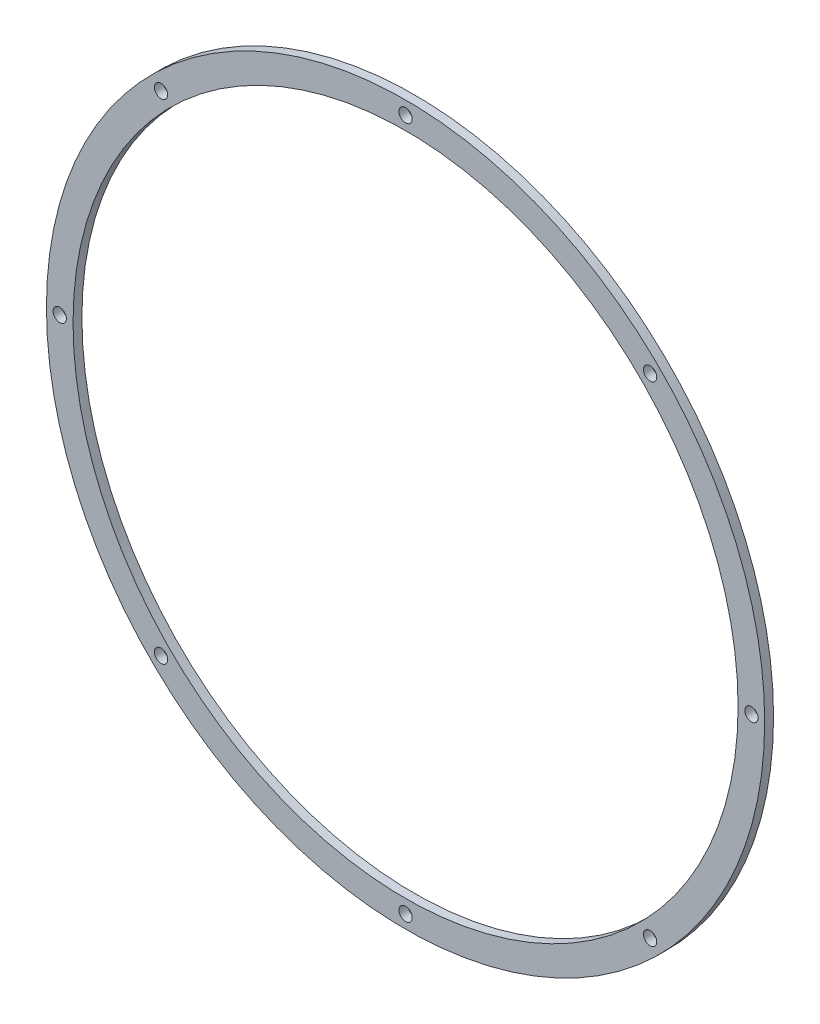
ISO-10303-21;
HEADER;
FILE_DESCRIPTION(('STEP AP214'),'2;1');
FILE_NAME('part.step','',(''),(''),'','','');
FILE_SCHEMA(('AUTOMOTIVE_DESIGN { 1 0 10303 214 1 1 1 1 }'));
ENDSEC;
DATA;
#1=APPLICATION_CONTEXT('core data for automotive mechanical design processes');
#2=APPLICATION_PROTOCOL_DEFINITION('international standard','automotive_design',2000,#1);
#3=PRODUCT_CONTEXT('',#1,'mechanical');
#4=PRODUCT('Part','Part','',(#3));
#5=PRODUCT_RELATED_PRODUCT_CATEGORY('part','',(#4));
#6=PRODUCT_DEFINITION_FORMATION('','',#4);
#7=PRODUCT_DEFINITION_CONTEXT('part definition',#1,'design');
#8=PRODUCT_DEFINITION('design','',#6,#7);
#9=PRODUCT_DEFINITION_SHAPE('','',#8);
#10=(LENGTH_UNIT() NAMED_UNIT(*) SI_UNIT(.MILLI.,.METRE.));
#11=(NAMED_UNIT(*) PLANE_ANGLE_UNIT() SI_UNIT($,.RADIAN.));
#12=(NAMED_UNIT(*) SI_UNIT($,.STERADIAN.) SOLID_ANGLE_UNIT());
#13=UNCERTAINTY_MEASURE_WITH_UNIT(LENGTH_MEASURE(1.E-05),#10,'distance_accuracy_value','');
#14=(GEOMETRIC_REPRESENTATION_CONTEXT(3) GLOBAL_UNCERTAINTY_ASSIGNED_CONTEXT((#13)) GLOBAL_UNIT_ASSIGNED_CONTEXT((#10,
#11,#12)) REPRESENTATION_CONTEXT('',''));
#15=CARTESIAN_POINT('',(0.,0.,0.));
#16=DIRECTION('',(0.,0.,1.));
#17=DIRECTION('',(1.,0.,0.));
#18=AXIS2_PLACEMENT_3D('',#15,#16,#17);
#19=CARTESIAN_POINT('',(0.,0.,2.));
#20=DIRECTION('',(0.,0.,1.));
#21=DIRECTION('',(1.,0.,0.));
#22=AXIS2_PLACEMENT_3D('',#19,#20,#21);
#23=PLANE('',#22);
#24=CARTESIAN_POINT('',(78.,-2.72335544429764E-13,2.));
#25=DIRECTION('',(0.,0.,1.));
#26=DIRECTION('',(0.,-1.,0.));
#27=AXIS2_PLACEMENT_3D('',#24,#25,#26);
#28=CIRCLE('',#27,1.5);
#29=CARTESIAN_POINT('',(78.,-1.50000000000027,2.));
#30=VERTEX_POINT('',#29);
#31=EDGE_CURVE('E80',#30,#30,#28,.T.);
#32=ORIENTED_EDGE('',*,*,#31,.F.);
#33=EDGE_LOOP('',(#32));
#34=FACE_BOUND('',#33,.T.);
#35=CARTESIAN_POINT('',(55.1543289325504,-55.154328932551,2.));
#36=DIRECTION('',(0.,0.,1.));
#37=DIRECTION('',(-0.707106781186551,-0.707106781186544,0.));
#38=AXIS2_PLACEMENT_3D('',#35,#36,#37);
#39=CIRCLE('',#38,1.5);
#40=CARTESIAN_POINT('',(54.0936687607706,-56.2149891043308,2.));
#41=VERTEX_POINT('',#40);
#42=EDGE_CURVE('E74',#41,#41,#39,.T.);
#43=ORIENTED_EDGE('',*,*,#42,.F.);
#44=EDGE_LOOP('',(#43));
#45=FACE_BOUND('',#44,.T.);
#46=CARTESIAN_POINT('',(0.,-78.,2.));
#47=DIRECTION('',(0.,0.,1.));
#48=DIRECTION('',(-1.,0.,0.));
#49=AXIS2_PLACEMENT_3D('',#46,#47,#48);
#50=CIRCLE('',#49,1.5);
#51=CARTESIAN_POINT('',(-1.5,-78.,2.));
#52=VERTEX_POINT('',#51);
#53=EDGE_CURVE('E66',#52,#52,#50,.T.);
#54=ORIENTED_EDGE('',*,*,#53,.F.);
#55=EDGE_LOOP('',(#54));
#56=FACE_BOUND('',#55,.T.);
#57=CARTESIAN_POINT('',(-55.1543289325512,-55.1543289325502,2.));
#58=DIRECTION('',(0.,0.,1.));
#59=DIRECTION('',(-0.707106781186541,0.707106781186554,0.));
#60=AXIS2_PLACEMENT_3D('',#57,#58,#59);
#61=CIRCLE('',#60,1.5);
#62=CARTESIAN_POINT('',(-56.214989104331,-54.0936687607704,2.));
#63=VERTEX_POINT('',#62);
#64=EDGE_CURVE('E67',#63,#63,#61,.T.);
#65=ORIENTED_EDGE('',*,*,#64,.F.);
#66=EDGE_LOOP('',(#65));
#67=FACE_BOUND('',#66,.T.);
#68=CARTESIAN_POINT('',(-78.,8.17006633289293E-13,2.));
#69=DIRECTION('',(0.,0.,1.));
#70=DIRECTION('',(0.,1.,0.));
#71=AXIS2_PLACEMENT_3D('',#68,#69,#70);
#72=CIRCLE('',#71,1.5);
#73=CARTESIAN_POINT('',(-78.,1.50000000000082,2.));
#74=VERTEX_POINT('',#73);
#75=EDGE_CURVE('E90',#74,#74,#72,.T.);
#76=ORIENTED_EDGE('',*,*,#75,.F.);
#77=EDGE_LOOP('',(#76));
#78=FACE_BOUND('',#77,.T.);
#79=CARTESIAN_POINT('',(-55.15432893255,55.1543289325514,2.));
#80=DIRECTION('',(0.,0.,1.));
#81=DIRECTION('',(0.707106781186556,0.707106781186539,0.));
#82=AXIS2_PLACEMENT_3D('',#79,#80,#81);
#83=CIRCLE('',#82,1.5);
#84=CARTESIAN_POINT('',(-54.0936687607702,56.2149891043312,2.));
#85=VERTEX_POINT('',#84);
#86=EDGE_CURVE('E91',#85,#85,#83,.T.);
#87=ORIENTED_EDGE('',*,*,#86,.F.);
#88=EDGE_LOOP('',(#87));
#89=FACE_BOUND('',#88,.T.);
#90=CARTESIAN_POINT('',(55.1543289325508,55.1543289325506,2.));
#91=DIRECTION('',(0.,0.,1.));
#92=DIRECTION('',(0.707106781186546,-0.707106781186549,0.));
#93=AXIS2_PLACEMENT_3D('',#90,#91,#92);
#94=CIRCLE('',#93,1.5);
#95=CARTESIAN_POINT('',(56.2149891043306,54.0936687607708,2.));
#96=VERTEX_POINT('',#95);
#97=EDGE_CURVE('E59',#96,#96,#94,.T.);
#98=ORIENTED_EDGE('',*,*,#97,.F.);
#99=EDGE_LOOP('',(#98));
#100=FACE_BOUND('',#99,.T.);
#101=CARTESIAN_POINT('',(0.,78.,2.));
#102=DIRECTION('',(0.,0.,1.));
#103=DIRECTION('',(1.,0.,0.));
#104=AXIS2_PLACEMENT_3D('',#101,#102,#103);
#105=CIRCLE('',#104,1.5);
#106=CARTESIAN_POINT('',(1.5,78.,2.));
#107=VERTEX_POINT('',#106);
#108=EDGE_CURVE('E53',#107,#107,#105,.T.);
#109=ORIENTED_EDGE('',*,*,#108,.F.);
#110=EDGE_LOOP('',(#109));
#111=FACE_BOUND('',#110,.T.);
#112=CARTESIAN_POINT('',(0.,0.,2.));
#113=DIRECTION('',(0.,0.,1.));
#114=DIRECTION('',(1.,0.,0.));
#115=AXIS2_PLACEMENT_3D('',#112,#113,#114);
#116=CIRCLE('',#115,81.);
#117=CARTESIAN_POINT('',(81.,0.,2.));
#118=VERTEX_POINT('',#117);
#119=EDGE_CURVE('E10',#118,#118,#116,.T.);
#120=ORIENTED_EDGE('',*,*,#119,.T.);
#121=EDGE_LOOP('',(#120));
#122=FACE_BOUND('',#121,.T.);
#123=CARTESIAN_POINT('',(0.,0.,2.));
#124=DIRECTION('',(0.,0.,1.));
#125=DIRECTION('',(1.,0.,0.));
#126=AXIS2_PLACEMENT_3D('',#123,#124,#125);
#127=CIRCLE('',#126,75.);
#128=CARTESIAN_POINT('',(75.,0.,2.));
#129=VERTEX_POINT('',#128);
#130=EDGE_CURVE('E43',#129,#129,#127,.T.);
#131=ORIENTED_EDGE('',*,*,#130,.F.);
#132=EDGE_LOOP('',(#131));
#133=FACE_BOUND('',#132,.T.);
#134=ADVANCED_FACE('F32',(#34,#45,#56,#67,#78,#89,#100,#111,#122,#133),#23,.T.);
#135=CARTESIAN_POINT('',(0.,0.,0.));
#136=DIRECTION('',(0.,0.,1.));
#137=DIRECTION('',(1.,0.,0.));
#138=AXIS2_PLACEMENT_3D('',#135,#136,#137);
#139=PLANE('',#138);
#140=CARTESIAN_POINT('',(78.,-2.72335544429764E-13,0.));
#141=DIRECTION('',(0.,0.,1.));
#142=DIRECTION('',(1.,0.,0.));
#143=AXIS2_PLACEMENT_3D('',#140,#141,#142);
#144=CIRCLE('',#143,1.5);
#145=CARTESIAN_POINT('',(79.5,-2.72335544429764E-13,0.));
#146=VERTEX_POINT('',#145);
#147=EDGE_CURVE('E62',#146,#146,#144,.F.);
#148=ORIENTED_EDGE('',*,*,#147,.F.);
#149=EDGE_LOOP('',(#148));
#150=FACE_BOUND('',#149,.T.);
#151=CARTESIAN_POINT('',(55.1543289325504,-55.154328932551,0.));
#152=DIRECTION('',(0.,0.,1.));
#153=DIRECTION('',(1.,0.,0.));
#154=AXIS2_PLACEMENT_3D('',#151,#152,#153);
#155=CIRCLE('',#154,1.5);
#156=CARTESIAN_POINT('',(56.6543289325504,-55.154328932551,0.));
#157=VERTEX_POINT('',#156);
#158=EDGE_CURVE('E77',#157,#157,#155,.F.);
#159=ORIENTED_EDGE('',*,*,#158,.F.);
#160=EDGE_LOOP('',(#159));
#161=FACE_BOUND('',#160,.T.);
#162=CARTESIAN_POINT('',(0.,-78.,0.));
#163=DIRECTION('',(0.,0.,1.));
#164=DIRECTION('',(1.,0.,0.));
#165=AXIS2_PLACEMENT_3D('',#162,#163,#164);
#166=CIRCLE('',#165,1.5);
#167=CARTESIAN_POINT('',(1.5,-78.,0.));
#168=VERTEX_POINT('',#167);
#169=EDGE_CURVE('E71',#168,#168,#166,.F.);
#170=ORIENTED_EDGE('',*,*,#169,.F.);
#171=EDGE_LOOP('',(#170));
#172=FACE_BOUND('',#171,.T.);
#173=CARTESIAN_POINT('',(-55.1543289325512,-55.1543289325502,0.));
#174=DIRECTION('',(0.,0.,1.));
#175=DIRECTION('',(1.,0.,0.));
#176=AXIS2_PLACEMENT_3D('',#173,#174,#175);
#177=CIRCLE('',#176,1.5);
#178=CARTESIAN_POINT('',(-53.6543289325512,-55.1543289325502,0.));
#179=VERTEX_POINT('',#178);
#180=EDGE_CURVE('E63',#179,#179,#177,.F.);
#181=ORIENTED_EDGE('',*,*,#180,.F.);
#182=EDGE_LOOP('',(#181));
#183=FACE_BOUND('',#182,.T.);
#184=CARTESIAN_POINT('',(-78.,8.17006633289293E-13,0.));
#185=DIRECTION('',(0.,0.,1.));
#186=DIRECTION('',(1.,0.,0.));
#187=AXIS2_PLACEMENT_3D('',#184,#185,#186);
#188=CIRCLE('',#187,1.5);
#189=CARTESIAN_POINT('',(-76.5,8.17006633289293E-13,0.));
#190=VERTEX_POINT('',#189);
#191=EDGE_CURVE('E70',#190,#190,#188,.F.);
#192=ORIENTED_EDGE('',*,*,#191,.F.);
#193=EDGE_LOOP('',(#192));
#194=FACE_BOUND('',#193,.T.);
#195=CARTESIAN_POINT('',(-55.15432893255,55.1543289325514,0.));
#196=DIRECTION('',(0.,0.,1.));
#197=DIRECTION('',(1.,0.,0.));
#198=AXIS2_PLACEMENT_3D('',#195,#196,#197);
#199=CIRCLE('',#198,1.5);
#200=CARTESIAN_POINT('',(-53.65432893255,55.1543289325514,0.));
#201=VERTEX_POINT('',#200);
#202=EDGE_CURVE('E87',#201,#201,#199,.F.);
#203=ORIENTED_EDGE('',*,*,#202,.F.);
#204=EDGE_LOOP('',(#203));
#205=FACE_BOUND('',#204,.T.);
#206=CARTESIAN_POINT('',(55.1543289325508,55.1543289325506,0.));
#207=DIRECTION('',(0.,0.,1.));
#208=DIRECTION('',(1.,0.,0.));
#209=AXIS2_PLACEMENT_3D('',#206,#207,#208);
#210=CIRCLE('',#209,1.5);
#211=CARTESIAN_POINT('',(56.6543289325508,55.1543289325506,0.));
#212=VERTEX_POINT('',#211);
#213=EDGE_CURVE('E56',#212,#212,#210,.F.);
#214=ORIENTED_EDGE('',*,*,#213,.F.);
#215=EDGE_LOOP('',(#214));
#216=FACE_BOUND('',#215,.T.);
#217=CARTESIAN_POINT('',(0.,78.,0.));
#218=DIRECTION('',(0.,0.,1.));
#219=DIRECTION('',(1.,0.,0.));
#220=AXIS2_PLACEMENT_3D('',#217,#218,#219);
#221=CIRCLE('',#220,1.5);
#222=CARTESIAN_POINT('',(1.5,78.,0.));
#223=VERTEX_POINT('',#222);
#224=EDGE_CURVE('E48',#223,#223,#221,.F.);
#225=ORIENTED_EDGE('',*,*,#224,.F.);
#226=EDGE_LOOP('',(#225));
#227=FACE_BOUND('',#226,.T.);
#228=CARTESIAN_POINT('',(0.,0.,0.));
#229=DIRECTION('',(0.,0.,1.));
#230=DIRECTION('',(1.,0.,0.));
#231=AXIS2_PLACEMENT_3D('',#228,#229,#230);
#232=CIRCLE('',#231,81.);
#233=CARTESIAN_POINT('',(81.,0.,0.));
#234=VERTEX_POINT('',#233);
#235=EDGE_CURVE('E36',#234,#234,#232,.T.);
#236=ORIENTED_EDGE('',*,*,#235,.F.);
#237=EDGE_LOOP('',(#236));
#238=FACE_BOUND('',#237,.T.);
#239=CARTESIAN_POINT('',(0.,0.,0.));
#240=DIRECTION('',(0.,0.,1.));
#241=DIRECTION('',(1.,0.,0.));
#242=AXIS2_PLACEMENT_3D('',#239,#240,#241);
#243=CIRCLE('',#242,75.);
#244=CARTESIAN_POINT('',(75.,0.,0.));
#245=VERTEX_POINT('',#244);
#246=EDGE_CURVE('E45',#245,#245,#243,.T.);
#247=ORIENTED_EDGE('',*,*,#246,.T.);
#248=EDGE_LOOP('',(#247));
#249=FACE_BOUND('',#248,.T.);
#250=ADVANCED_FACE('F103',(#150,#161,#172,#183,#194,#205,#216,#227,#238,#249),#139,.F.);
#251=CARTESIAN_POINT('',(0.,0.,2.));
#252=DIRECTION('',(0.,0.,-1.));
#253=DIRECTION('',(-1.,0.,0.));
#254=AXIS2_PLACEMENT_3D('',#251,#252,#253);
#255=CYLINDRICAL_SURFACE('',#254,81.);
#256=ORIENTED_EDGE('',*,*,#119,.F.);
#257=EDGE_LOOP('',(#256));
#258=FACE_BOUND('',#257,.T.);
#259=ORIENTED_EDGE('',*,*,#235,.T.);
#260=EDGE_LOOP('',(#259));
#261=FACE_BOUND('',#260,.T.);
#262=ADVANCED_FACE('F34',(#258,#261),#255,.T.);
#263=CARTESIAN_POINT('',(0.,0.,2.));
#264=DIRECTION('',(0.,0.,-1.));
#265=DIRECTION('',(-1.,0.,0.));
#266=AXIS2_PLACEMENT_3D('',#263,#264,#265);
#267=CYLINDRICAL_SURFACE('',#266,75.);
#268=ORIENTED_EDGE('',*,*,#130,.T.);
#269=EDGE_LOOP('',(#268));
#270=FACE_BOUND('',#269,.T.);
#271=ORIENTED_EDGE('',*,*,#246,.F.);
#272=EDGE_LOOP('',(#271));
#273=FACE_BOUND('',#272,.T.);
#274=ADVANCED_FACE('F114',(#270,#273),#267,.F.);
#275=CARTESIAN_POINT('',(0.,78.,-4.24264068711929));
#276=DIRECTION('',(0.,0.,1.));
#277=DIRECTION('',(1.,0.,0.));
#278=AXIS2_PLACEMENT_3D('',#275,#276,#277);
#279=CYLINDRICAL_SURFACE('',#278,1.5);
#280=ORIENTED_EDGE('',*,*,#224,.T.);
#281=EDGE_LOOP('',(#280));
#282=FACE_BOUND('',#281,.T.);
#283=ORIENTED_EDGE('',*,*,#108,.T.);
#284=EDGE_LOOP('',(#283));
#285=FACE_BOUND('',#284,.T.);
#286=ADVANCED_FACE('F117',(#282,#285),#279,.F.);
#287=CARTESIAN_POINT('',(55.1543289325508,55.1543289325506,-4.24264068711929));
#288=DIRECTION('',(0.,0.,1.));
#289=DIRECTION('',(1.,0.,0.));
#290=AXIS2_PLACEMENT_3D('',#287,#288,#289);
#291=CYLINDRICAL_SURFACE('',#290,1.5);
#292=ORIENTED_EDGE('',*,*,#213,.T.);
#293=EDGE_LOOP('',(#292));
#294=FACE_BOUND('',#293,.T.);
#295=ORIENTED_EDGE('',*,*,#97,.T.);
#296=EDGE_LOOP('',(#295));
#297=FACE_BOUND('',#296,.T.);
#298=ADVANCED_FACE('F132',(#294,#297),#291,.F.);
#299=CARTESIAN_POINT('',(-55.15432893255,55.1543289325514,-4.24264068711929));
#300=DIRECTION('',(0.,0.,1.));
#301=DIRECTION('',(1.,0.,0.));
#302=AXIS2_PLACEMENT_3D('',#299,#300,#301);
#303=CYLINDRICAL_SURFACE('',#302,1.5);
#304=ORIENTED_EDGE('',*,*,#202,.T.);
#305=EDGE_LOOP('',(#304));
#306=FACE_BOUND('',#305,.T.);
#307=ORIENTED_EDGE('',*,*,#86,.T.);
#308=EDGE_LOOP('',(#307));
#309=FACE_BOUND('',#308,.T.);
#310=ADVANCED_FACE('F136',(#306,#309),#303,.F.);
#311=CARTESIAN_POINT('',(-78.,8.17006633289293E-13,-4.24264068711929));
#312=DIRECTION('',(0.,0.,1.));
#313=DIRECTION('',(1.,0.,0.));
#314=AXIS2_PLACEMENT_3D('',#311,#312,#313);
#315=CYLINDRICAL_SURFACE('',#314,1.5);
#316=ORIENTED_EDGE('',*,*,#191,.T.);
#317=EDGE_LOOP('',(#316));
#318=FACE_BOUND('',#317,.T.);
#319=ORIENTED_EDGE('',*,*,#75,.T.);
#320=EDGE_LOOP('',(#319));
#321=FACE_BOUND('',#320,.T.);
#322=ADVANCED_FACE('F99',(#318,#321),#315,.F.);
#323=CARTESIAN_POINT('',(-55.1543289325512,-55.1543289325502,-4.24264068711929));
#324=DIRECTION('',(0.,0.,1.));
#325=DIRECTION('',(1.,0.,0.));
#326=AXIS2_PLACEMENT_3D('',#323,#324,#325);
#327=CYLINDRICAL_SURFACE('',#326,1.5);
#328=ORIENTED_EDGE('',*,*,#180,.T.);
#329=EDGE_LOOP('',(#328));
#330=FACE_BOUND('',#329,.T.);
#331=ORIENTED_EDGE('',*,*,#64,.T.);
#332=EDGE_LOOP('',(#331));
#333=FACE_BOUND('',#332,.T.);
#334=ADVANCED_FACE('F138',(#330,#333),#327,.F.);
#335=CARTESIAN_POINT('',(0.,-78.,-4.24264068711929));
#336=DIRECTION('',(0.,0.,1.));
#337=DIRECTION('',(1.,0.,0.));
#338=AXIS2_PLACEMENT_3D('',#335,#336,#337);
#339=CYLINDRICAL_SURFACE('',#338,1.5);
#340=ORIENTED_EDGE('',*,*,#169,.T.);
#341=EDGE_LOOP('',(#340));
#342=FACE_BOUND('',#341,.T.);
#343=ORIENTED_EDGE('',*,*,#53,.T.);
#344=EDGE_LOOP('',(#343));
#345=FACE_BOUND('',#344,.T.);
#346=ADVANCED_FACE('F141',(#342,#345),#339,.F.);
#347=CARTESIAN_POINT('',(55.1543289325504,-55.154328932551,-4.24264068711929));
#348=DIRECTION('',(0.,0.,1.));
#349=DIRECTION('',(1.,0.,0.));
#350=AXIS2_PLACEMENT_3D('',#347,#348,#349);
#351=CYLINDRICAL_SURFACE('',#350,1.5);
#352=ORIENTED_EDGE('',*,*,#158,.T.);
#353=EDGE_LOOP('',(#352));
#354=FACE_BOUND('',#353,.T.);
#355=ORIENTED_EDGE('',*,*,#42,.T.);
#356=EDGE_LOOP('',(#355));
#357=FACE_BOUND('',#356,.T.);
#358=ADVANCED_FACE('F145',(#354,#357),#351,.F.);
#359=CARTESIAN_POINT('',(78.,-2.72335544429764E-13,-4.24264068711929));
#360=DIRECTION('',(0.,0.,1.));
#361=DIRECTION('',(1.,0.,0.));
#362=AXIS2_PLACEMENT_3D('',#359,#360,#361);
#363=CYLINDRICAL_SURFACE('',#362,1.5);
#364=ORIENTED_EDGE('',*,*,#147,.T.);
#365=EDGE_LOOP('',(#364));
#366=FACE_BOUND('',#365,.T.);
#367=ORIENTED_EDGE('',*,*,#31,.T.);
#368=EDGE_LOOP('',(#367));
#369=FACE_BOUND('',#368,.T.);
#370=ADVANCED_FACE('F149',(#366,#369),#363,.F.);
#371=CLOSED_SHELL('',(#134,#250,#262,#274,#286,#298,#310,#322,#334,#346,#358,#370));
#372=MANIFOLD_SOLID_BREP('B2',#371);
#373=ADVANCED_BREP_SHAPE_REPRESENTATION('',(#18,#372),#14);
#374=SHAPE_DEFINITION_REPRESENTATION(#9,#373);
ENDSEC;
END-ISO-10303-21;
